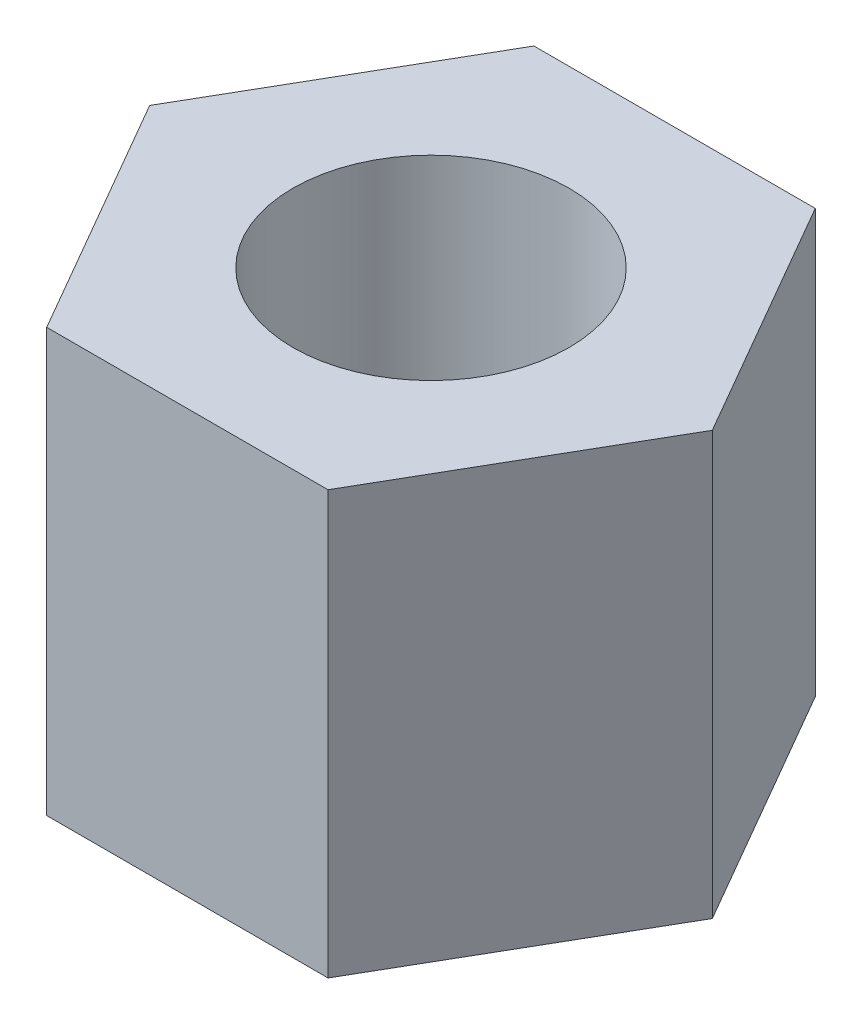
ISO-10303-21;
HEADER;
FILE_DESCRIPTION(('STEP AP214'),'2;1');
FILE_NAME('part.step','',(''),(''),'','','');
FILE_SCHEMA(('AUTOMOTIVE_DESIGN { 1 0 10303 214 1 1 1 1 }'));
ENDSEC;
DATA;
#1=APPLICATION_CONTEXT('core data for automotive mechanical design processes');
#2=APPLICATION_PROTOCOL_DEFINITION('international standard','automotive_design',2000,#1);
#3=PRODUCT_CONTEXT('',#1,'mechanical');
#4=PRODUCT('Part','Part','',(#3));
#5=PRODUCT_RELATED_PRODUCT_CATEGORY('part','',(#4));
#6=PRODUCT_DEFINITION_FORMATION('','',#4);
#7=PRODUCT_DEFINITION_CONTEXT('part definition',#1,'design');
#8=PRODUCT_DEFINITION('design','',#6,#7);
#9=PRODUCT_DEFINITION_SHAPE('','',#8);
#10=(LENGTH_UNIT() NAMED_UNIT(*) SI_UNIT(.MILLI.,.METRE.));
#11=(NAMED_UNIT(*) PLANE_ANGLE_UNIT() SI_UNIT($,.RADIAN.));
#12=(NAMED_UNIT(*) SI_UNIT($,.STERADIAN.) SOLID_ANGLE_UNIT());
#13=UNCERTAINTY_MEASURE_WITH_UNIT(LENGTH_MEASURE(1.E-05),#10,'distance_accuracy_value','');
#14=(GEOMETRIC_REPRESENTATION_CONTEXT(3) GLOBAL_UNCERTAINTY_ASSIGNED_CONTEXT((#13)) GLOBAL_UNIT_ASSIGNED_CONTEXT((#10,
#11,#12)) REPRESENTATION_CONTEXT('',''));
#15=CARTESIAN_POINT('',(0.,0.,0.));
#16=DIRECTION('',(0.,0.,1.));
#17=DIRECTION('',(1.,0.,0.));
#18=AXIS2_PLACEMENT_3D('',#15,#16,#17);
#19=CARTESIAN_POINT('',(6.92820323027551,0.,0.));
#20=DIRECTION('',(0.,-1.,0.));
#21=DIRECTION('',(0.,0.,-1.));
#22=AXIS2_PLACEMENT_3D('',#19,#20,#21);
#23=PLANE('',#22);
#24=DIRECTION('',(-0.5,0.,-0.866025403784438));
#25=VECTOR('',#24,1.);
#26=CARTESIAN_POINT('',(6.92820323027551,0.,0.));
#27=LINE('',#26,#25);
#28=CARTESIAN_POINT('',(6.92820323027551,0.,0.));
#29=VERTEX_POINT('',#28);
#30=CARTESIAN_POINT('',(3.46410161513775,0.,-6.));
#31=VERTEX_POINT('',#30);
#32=EDGE_CURVE('E115',#29,#31,#27,.T.);
#33=ORIENTED_EDGE('',*,*,#32,.F.);
#34=DIRECTION('',(0.5,0.,-0.866025403784438));
#35=VECTOR('',#34,1.);
#36=CARTESIAN_POINT('',(3.46410161513775,0.,6.));
#37=LINE('',#36,#35);
#38=CARTESIAN_POINT('',(3.46410161513775,0.,6.));
#39=VERTEX_POINT('',#38);
#40=EDGE_CURVE('E76',#39,#29,#37,.T.);
#41=ORIENTED_EDGE('',*,*,#40,.F.);
#42=DIRECTION('',(1.,0.,0.));
#43=VECTOR('',#42,1.);
#44=CARTESIAN_POINT('',(-3.46410161513775,0.,6.));
#45=LINE('',#44,#43);
#46=CARTESIAN_POINT('',(-3.46410161513775,0.,6.));
#47=VERTEX_POINT('',#46);
#48=EDGE_CURVE('E70',#47,#39,#45,.T.);
#49=ORIENTED_EDGE('',*,*,#48,.F.);
#50=DIRECTION('',(0.5,0.,0.866025403784439));
#51=VECTOR('',#50,1.);
#52=CARTESIAN_POINT('',(-6.92820323027551,0.,0.));
#53=LINE('',#52,#51);
#54=CARTESIAN_POINT('',(-6.92820323027551,0.,0.));
#55=VERTEX_POINT('',#54);
#56=EDGE_CURVE('E105',#55,#47,#53,.T.);
#57=ORIENTED_EDGE('',*,*,#56,.F.);
#58=DIRECTION('',(-0.5,0.,0.866025403784439));
#59=VECTOR('',#58,1.);
#60=CARTESIAN_POINT('',(-3.46410161513775,0.,-6.));
#61=LINE('',#60,#59);
#62=CARTESIAN_POINT('',(-3.46410161513775,0.,-6.));
#63=VERTEX_POINT('',#62);
#64=EDGE_CURVE('E121',#63,#55,#61,.T.);
#65=ORIENTED_EDGE('',*,*,#64,.F.);
#66=DIRECTION('',(-1.,0.,0.));
#67=VECTOR('',#66,1.);
#68=CARTESIAN_POINT('',(3.46410161513775,0.,-6.));
#69=LINE('',#68,#67);
#70=EDGE_CURVE('E118',#31,#63,#69,.T.);
#71=ORIENTED_EDGE('',*,*,#70,.F.);
#72=EDGE_LOOP('',(#33,#41,#49,#57,#65,#71));
#73=FACE_BOUND('',#72,.T.);
#74=CARTESIAN_POINT('',(0.,0.,0.));
#75=DIRECTION('',(0.,1.,0.));
#76=DIRECTION('',(0.,0.,1.));
#77=AXIS2_PLACEMENT_3D('',#74,#75,#76);
#78=CIRCLE('',#77,3.4);
#79=CARTESIAN_POINT('',(0.,0.,3.4));
#80=VERTEX_POINT('',#79);
#81=EDGE_CURVE('E164',#80,#80,#78,.T.);
#82=ORIENTED_EDGE('',*,*,#81,.T.);
#83=EDGE_LOOP('',(#82));
#84=FACE_BOUND('',#83,.T.);
#85=ADVANCED_FACE('F30',(#73,#84),#23,.T.);
#86=CARTESIAN_POINT('',(6.92820323027551,10.414,0.));
#87=DIRECTION('',(-0.866025403784438,0.,0.5));
#88=DIRECTION('',(0.5,0.,0.866025403784439));
#89=AXIS2_PLACEMENT_3D('',#86,#87,#88);
#90=PLANE('',#89);
#91=ORIENTED_EDGE('',*,*,#32,.T.);
#92=DIRECTION('',(0.,-1.,0.));
#93=VECTOR('',#92,1.);
#94=CARTESIAN_POINT('',(3.46410161513775,10.414,-6.));
#95=LINE('',#94,#93);
#96=CARTESIAN_POINT('',(3.46410161513775,10.414,-6.));
#97=VERTEX_POINT('',#96);
#98=EDGE_CURVE('E11',#97,#31,#95,.T.);
#99=ORIENTED_EDGE('',*,*,#98,.F.);
#100=DIRECTION('',(-0.5,0.,-0.866025403784438));
#101=VECTOR('',#100,1.);
#102=CARTESIAN_POINT('',(6.92820323027551,10.414,0.));
#103=LINE('',#102,#101);
#104=CARTESIAN_POINT('',(6.92820323027551,10.414,0.));
#105=VERTEX_POINT('',#104);
#106=EDGE_CURVE('E126',#105,#97,#103,.T.);
#107=ORIENTED_EDGE('',*,*,#106,.F.);
#108=DIRECTION('',(0.,-1.,0.));
#109=VECTOR('',#108,1.);
#110=CARTESIAN_POINT('',(6.92820323027551,10.414,0.));
#111=LINE('',#110,#109);
#112=EDGE_CURVE('E111',#105,#29,#111,.T.);
#113=ORIENTED_EDGE('',*,*,#112,.T.);
#114=EDGE_LOOP('',(#91,#99,#107,#113));
#115=FACE_BOUND('',#114,.T.);
#116=ADVANCED_FACE('F32',(#115),#90,.F.);
#117=CARTESIAN_POINT('',(3.46410161513775,10.414,-6.));
#118=DIRECTION('',(0.,0.,1.));
#119=DIRECTION('',(1.,0.,0.));
#120=AXIS2_PLACEMENT_3D('',#117,#118,#119);
#121=PLANE('',#120);
#122=ORIENTED_EDGE('',*,*,#70,.T.);
#123=DIRECTION('',(0.,-1.,0.));
#124=VECTOR('',#123,1.);
#125=CARTESIAN_POINT('',(-3.46410161513775,10.414,-6.));
#126=LINE('',#125,#124);
#127=CARTESIAN_POINT('',(-3.46410161513775,10.414,-6.));
#128=VERTEX_POINT('',#127);
#129=EDGE_CURVE('E39',#128,#63,#126,.T.);
#130=ORIENTED_EDGE('',*,*,#129,.F.);
#131=DIRECTION('',(-1.,0.,0.));
#132=VECTOR('',#131,1.);
#133=CARTESIAN_POINT('',(3.46410161513775,10.414,-6.));
#134=LINE('',#133,#132);
#135=EDGE_CURVE('E84',#97,#128,#134,.T.);
#136=ORIENTED_EDGE('',*,*,#135,.F.);
#137=ORIENTED_EDGE('',*,*,#98,.T.);
#138=EDGE_LOOP('',(#122,#130,#136,#137));
#139=FACE_BOUND('',#138,.T.);
#140=ADVANCED_FACE('F155',(#139),#121,.F.);
#141=CARTESIAN_POINT('',(-3.46410161513775,10.414,-6.));
#142=DIRECTION('',(0.866025403784438,0.,0.5));
#143=DIRECTION('',(0.5,0.,-0.866025403784439));
#144=AXIS2_PLACEMENT_3D('',#141,#142,#143);
#145=PLANE('',#144);
#146=ORIENTED_EDGE('',*,*,#64,.T.);
#147=DIRECTION('',(0.,-1.,0.));
#148=VECTOR('',#147,1.);
#149=CARTESIAN_POINT('',(-6.92820323027551,10.414,0.));
#150=LINE('',#149,#148);
#151=CARTESIAN_POINT('',(-6.92820323027551,10.414,0.));
#152=VERTEX_POINT('',#151);
#153=EDGE_CURVE('E106',#152,#55,#150,.T.);
#154=ORIENTED_EDGE('',*,*,#153,.F.);
#155=DIRECTION('',(-0.5,0.,0.866025403784439));
#156=VECTOR('',#155,1.);
#157=CARTESIAN_POINT('',(-3.46410161513775,10.414,-6.));
#158=LINE('',#157,#156);
#159=EDGE_CURVE('E97',#128,#152,#158,.T.);
#160=ORIENTED_EDGE('',*,*,#159,.F.);
#161=ORIENTED_EDGE('',*,*,#129,.T.);
#162=EDGE_LOOP('',(#146,#154,#160,#161));
#163=FACE_BOUND('',#162,.T.);
#164=ADVANCED_FACE('F132',(#163),#145,.F.);
#165=CARTESIAN_POINT('',(-6.92820323027551,10.414,0.));
#166=DIRECTION('',(0.866025403784439,0.,-0.5));
#167=DIRECTION('',(-0.5,0.,-0.866025403784439));
#168=AXIS2_PLACEMENT_3D('',#165,#166,#167);
#169=PLANE('',#168);
#170=ORIENTED_EDGE('',*,*,#56,.T.);
#171=DIRECTION('',(0.,-1.,0.));
#172=VECTOR('',#171,1.);
#173=CARTESIAN_POINT('',(-3.46410161513775,10.414,6.));
#174=LINE('',#173,#172);
#175=CARTESIAN_POINT('',(-3.46410161513775,10.414,6.));
#176=VERTEX_POINT('',#175);
#177=EDGE_CURVE('E102',#176,#47,#174,.T.);
#178=ORIENTED_EDGE('',*,*,#177,.F.);
#179=DIRECTION('',(0.5,0.,0.866025403784439));
#180=VECTOR('',#179,1.);
#181=CARTESIAN_POINT('',(-6.92820323027551,10.414,0.));
#182=LINE('',#181,#180);
#183=EDGE_CURVE('E91',#152,#176,#182,.T.);
#184=ORIENTED_EDGE('',*,*,#183,.F.);
#185=ORIENTED_EDGE('',*,*,#153,.T.);
#186=EDGE_LOOP('',(#170,#178,#184,#185));
#187=FACE_BOUND('',#186,.T.);
#188=ADVANCED_FACE('F103',(#187),#169,.F.);
#189=CARTESIAN_POINT('',(-3.46410161513775,10.414,6.));
#190=DIRECTION('',(0.,0.,-1.));
#191=DIRECTION('',(-1.,0.,0.));
#192=AXIS2_PLACEMENT_3D('',#189,#190,#191);
#193=PLANE('',#192);
#194=ORIENTED_EDGE('',*,*,#48,.T.);
#195=DIRECTION('',(0.,-1.,0.));
#196=VECTOR('',#195,1.);
#197=CARTESIAN_POINT('',(3.46410161513775,10.414,6.));
#198=LINE('',#197,#196);
#199=CARTESIAN_POINT('',(3.46410161513775,10.414,6.));
#200=VERTEX_POINT('',#199);
#201=EDGE_CURVE('E107',#200,#39,#198,.T.);
#202=ORIENTED_EDGE('',*,*,#201,.F.);
#203=DIRECTION('',(1.,0.,0.));
#204=VECTOR('',#203,1.);
#205=CARTESIAN_POINT('',(-3.46410161513775,10.414,6.));
#206=LINE('',#205,#204);
#207=EDGE_CURVE('E95',#176,#200,#206,.T.);
#208=ORIENTED_EDGE('',*,*,#207,.F.);
#209=ORIENTED_EDGE('',*,*,#177,.T.);
#210=EDGE_LOOP('',(#194,#202,#208,#209));
#211=FACE_BOUND('',#210,.T.);
#212=ADVANCED_FACE('F109',(#211),#193,.F.);
#213=CARTESIAN_POINT('',(3.46410161513775,10.414,6.));
#214=DIRECTION('',(-0.866025403784438,0.,-0.5));
#215=DIRECTION('',(-0.5,0.,0.866025403784439));
#216=AXIS2_PLACEMENT_3D('',#213,#214,#215);
#217=PLANE('',#216);
#218=ORIENTED_EDGE('',*,*,#40,.T.);
#219=ORIENTED_EDGE('',*,*,#112,.F.);
#220=DIRECTION('',(0.5,0.,-0.866025403784438));
#221=VECTOR('',#220,1.);
#222=CARTESIAN_POINT('',(3.46410161513775,10.414,6.));
#223=LINE('',#222,#221);
#224=EDGE_CURVE('E47',#200,#105,#223,.T.);
#225=ORIENTED_EDGE('',*,*,#224,.F.);
#226=ORIENTED_EDGE('',*,*,#201,.T.);
#227=EDGE_LOOP('',(#218,#219,#225,#226));
#228=FACE_BOUND('',#227,.T.);
#229=ADVANCED_FACE('F139',(#228),#217,.F.);
#230=CARTESIAN_POINT('',(6.92820323027551,10.414,0.));
#231=DIRECTION('',(0.,-1.,0.));
#232=DIRECTION('',(0.,0.,-1.));
#233=AXIS2_PLACEMENT_3D('',#230,#231,#232);
#234=PLANE('',#233);
#235=CARTESIAN_POINT('',(0.,10.414,0.));
#236=DIRECTION('',(0.,1.,0.));
#237=DIRECTION('',(0.,0.,1.));
#238=AXIS2_PLACEMENT_3D('',#235,#236,#237);
#239=CIRCLE('',#238,3.39999999999999);
#240=CARTESIAN_POINT('',(0.,10.414,3.39999999999999));
#241=VERTEX_POINT('',#240);
#242=EDGE_CURVE('E119',#241,#241,#239,.T.);
#243=ORIENTED_EDGE('',*,*,#242,.F.);
#244=EDGE_LOOP('',(#243));
#245=FACE_BOUND('',#244,.T.);
#246=ORIENTED_EDGE('',*,*,#106,.T.);
#247=ORIENTED_EDGE('',*,*,#135,.T.);
#248=ORIENTED_EDGE('',*,*,#159,.T.);
#249=ORIENTED_EDGE('',*,*,#183,.T.);
#250=ORIENTED_EDGE('',*,*,#207,.T.);
#251=ORIENTED_EDGE('',*,*,#224,.T.);
#252=EDGE_LOOP('',(#246,#247,#248,#249,#250,#251));
#253=FACE_BOUND('',#252,.T.);
#254=ADVANCED_FACE('F93',(#245,#253),#234,.F.);
#255=CARTESIAN_POINT('',(0.,10.414,0.));
#256=DIRECTION('',(0.,1.,0.));
#257=DIRECTION('',(0.,0.,1.));
#258=AXIS2_PLACEMENT_3D('',#255,#256,#257);
#259=CYLINDRICAL_SURFACE('',#258,3.39999999999999);
#260=ORIENTED_EDGE('',*,*,#81,.F.);
#261=EDGE_LOOP('',(#260));
#262=FACE_BOUND('',#261,.T.);
#263=ORIENTED_EDGE('',*,*,#242,.T.);
#264=EDGE_LOOP('',(#263));
#265=FACE_BOUND('',#264,.T.);
#266=ADVANCED_FACE('F146',(#262,#265),#259,.F.);
#267=CLOSED_SHELL('',(#85,#116,#140,#164,#188,#212,#229,#254,#266));
#268=MANIFOLD_SOLID_BREP('B2',#267);
#269=ADVANCED_BREP_SHAPE_REPRESENTATION('',(#18,#268),#14);
#270=SHAPE_DEFINITION_REPRESENTATION(#9,#269);
ENDSEC;
END-ISO-10303-21;
